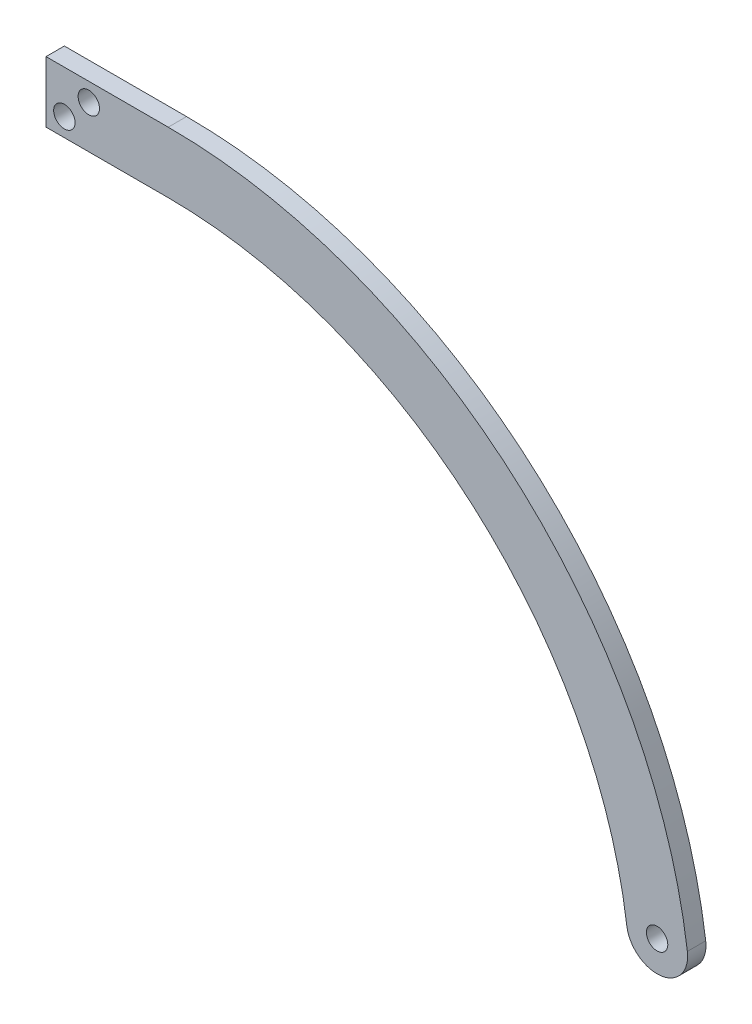
ISO-10303-21;
HEADER;
FILE_DESCRIPTION(('STEP AP214'),'2;1');
FILE_NAME('part.step','',(''),(''),'','','');
FILE_SCHEMA(('AUTOMOTIVE_DESIGN { 1 0 10303 214 1 1 1 1 }'));
ENDSEC;
DATA;
#1=APPLICATION_CONTEXT('core data for automotive mechanical design processes');
#2=APPLICATION_PROTOCOL_DEFINITION('international standard','automotive_design',2000,#1);
#3=PRODUCT_CONTEXT('',#1,'mechanical');
#4=PRODUCT('Part','Part','',(#3));
#5=PRODUCT_RELATED_PRODUCT_CATEGORY('part','',(#4));
#6=PRODUCT_DEFINITION_FORMATION('','',#4);
#7=PRODUCT_DEFINITION_CONTEXT('part definition',#1,'design');
#8=PRODUCT_DEFINITION('design','',#6,#7);
#9=PRODUCT_DEFINITION_SHAPE('','',#8);
#10=(LENGTH_UNIT() NAMED_UNIT(*) SI_UNIT(.MILLI.,.METRE.));
#11=(NAMED_UNIT(*) PLANE_ANGLE_UNIT() SI_UNIT($,.RADIAN.));
#12=(NAMED_UNIT(*) SI_UNIT($,.STERADIAN.) SOLID_ANGLE_UNIT());
#13=UNCERTAINTY_MEASURE_WITH_UNIT(LENGTH_MEASURE(1.E-05),#10,'distance_accuracy_value','');
#14=(GEOMETRIC_REPRESENTATION_CONTEXT(3) GLOBAL_UNCERTAINTY_ASSIGNED_CONTEXT((#13)) GLOBAL_UNIT_ASSIGNED_CONTEXT((#10,
#11,#12)) REPRESENTATION_CONTEXT('',''));
#15=CARTESIAN_POINT('',(0.,0.,0.));
#16=DIRECTION('',(0.,0.,1.));
#17=DIRECTION('',(1.,0.,0.));
#18=AXIS2_PLACEMENT_3D('',#15,#16,#17);
#19=CARTESIAN_POINT('',(0.,-4.99999999999999,3.));
#20=DIRECTION('',(0.,1.,0.));
#21=DIRECTION('',(-1.,0.,0.));
#22=AXIS2_PLACEMENT_3D('',#19,#20,#21);
#23=PLANE('',#22);
#24=DIRECTION('',(1.,0.,0.));
#25=VECTOR('',#24,1.);
#26=CARTESIAN_POINT('',(0.,-4.99999999999999,0.));
#27=LINE('',#26,#25);
#28=CARTESIAN_POINT('',(-20.,-4.99999999999998,0.));
#29=VERTEX_POINT('',#28);
#30=CARTESIAN_POINT('',(0.,-4.99999999999999,0.));
#31=VERTEX_POINT('',#30);
#32=EDGE_CURVE('E126',#29,#31,#27,.T.);
#33=ORIENTED_EDGE('',*,*,#32,.T.);
#34=DIRECTION('',(0.,0.,-1.));
#35=VECTOR('',#34,1.);
#36=CARTESIAN_POINT('',(0.,-4.99999999999999,3.));
#37=LINE('',#36,#35);
#38=CARTESIAN_POINT('',(0.,-4.99999999999999,3.));
#39=VERTEX_POINT('',#38);
#40=EDGE_CURVE('E11',#39,#31,#37,.T.);
#41=ORIENTED_EDGE('',*,*,#40,.F.);
#42=DIRECTION('',(1.,0.,0.));
#43=VECTOR('',#42,1.);
#44=CARTESIAN_POINT('',(0.,-4.99999999999999,3.));
#45=LINE('',#44,#43);
#46=CARTESIAN_POINT('',(-20.,-4.99999999999998,3.));
#47=VERTEX_POINT('',#46);
#48=EDGE_CURVE('E80',#47,#39,#45,.T.);
#49=ORIENTED_EDGE('',*,*,#48,.F.);
#50=DIRECTION('',(0.,0.,-1.));
#51=VECTOR('',#50,1.);
#52=CARTESIAN_POINT('',(-20.,-4.99999999999998,3.));
#53=LINE('',#52,#51);
#54=EDGE_CURVE('E125',#47,#29,#53,.T.);
#55=ORIENTED_EDGE('',*,*,#54,.T.);
#56=EDGE_LOOP('',(#33,#41,#49,#55));
#57=FACE_BOUND('',#56,.T.);
#58=ADVANCED_FACE('F34',(#57),#23,.F.);
#59=CARTESIAN_POINT('',(0.,-80.7142857142857,3.));
#60=DIRECTION('',(0.,0.,-1.));
#61=DIRECTION('',(-1.,0.,0.));
#62=AXIS2_PLACEMENT_3D('',#59,#60,#61);
#63=CYLINDRICAL_SURFACE('',#62,75.7142857142857);
#64=CARTESIAN_POINT('',(0.,-80.7142857142857,0.));
#65=DIRECTION('',(0.,0.,1.));
#66=DIRECTION('',(1.,0.,0.));
#67=AXIS2_PLACEMENT_3D('',#64,#65,#66);
#68=CIRCLE('',#67,75.7142857142857);
#69=CARTESIAN_POINT('',(75.0442477876106,-70.6637168141593,0.));
#70=VERTEX_POINT('',#69);
#71=EDGE_CURVE('E129',#70,#31,#68,.T.);
#72=ORIENTED_EDGE('',*,*,#71,.F.);
#73=DIRECTION('',(0.,0.,-1.));
#74=VECTOR('',#73,1.);
#75=CARTESIAN_POINT('',(75.0442477876106,-70.6637168141593,3.));
#76=LINE('',#75,#74);
#77=CARTESIAN_POINT('',(75.0442477876106,-70.6637168141593,3.));
#78=VERTEX_POINT('',#77);
#79=EDGE_CURVE('E42',#78,#70,#76,.T.);
#80=ORIENTED_EDGE('',*,*,#79,.F.);
#81=CARTESIAN_POINT('',(0.,-80.7142857142857,3.));
#82=DIRECTION('',(0.,0.,1.));
#83=DIRECTION('',(1.,0.,0.));
#84=AXIS2_PLACEMENT_3D('',#81,#82,#83);
#85=CIRCLE('',#84,75.7142857142857);
#86=EDGE_CURVE('E160',#78,#39,#85,.T.);
#87=ORIENTED_EDGE('',*,*,#86,.T.);
#88=ORIENTED_EDGE('',*,*,#40,.T.);
#89=EDGE_LOOP('',(#72,#80,#87,#88));
#90=FACE_BOUND('',#89,.T.);
#91=ADVANCED_FACE('F159',(#90),#63,.F.);
#92=CARTESIAN_POINT('',(80.,-70.,3.));
#93=DIRECTION('',(0.,0.,-1.));
#94=DIRECTION('',(-1.,0.,0.));
#95=AXIS2_PLACEMENT_3D('',#92,#93,#94);
#96=CYLINDRICAL_SURFACE('',#95,5.);
#97=CARTESIAN_POINT('',(80.,-70.,0.));
#98=DIRECTION('',(0.,0.,1.));
#99=DIRECTION('',(1.,0.,0.));
#100=AXIS2_PLACEMENT_3D('',#97,#98,#99);
#101=CIRCLE('',#100,5.);
#102=CARTESIAN_POINT('',(84.9557522123894,-69.3362831858407,0.));
#103=VERTEX_POINT('',#102);
#104=EDGE_CURVE('E132',#70,#103,#101,.T.);
#105=ORIENTED_EDGE('',*,*,#104,.T.);
#106=DIRECTION('',(0.,0.,-1.));
#107=VECTOR('',#106,1.);
#108=CARTESIAN_POINT('',(84.9557522123894,-69.3362831858407,3.));
#109=LINE('',#108,#107);
#110=CARTESIAN_POINT('',(84.9557522123894,-69.3362831858407,3.));
#111=VERTEX_POINT('',#110);
#112=EDGE_CURVE('E109',#111,#103,#109,.T.);
#113=ORIENTED_EDGE('',*,*,#112,.F.);
#114=CARTESIAN_POINT('',(80.,-70.,3.));
#115=DIRECTION('',(0.,0.,1.));
#116=DIRECTION('',(1.,0.,0.));
#117=AXIS2_PLACEMENT_3D('',#114,#115,#116);
#118=CIRCLE('',#117,5.);
#119=EDGE_CURVE('E96',#78,#111,#118,.T.);
#120=ORIENTED_EDGE('',*,*,#119,.F.);
#121=ORIENTED_EDGE('',*,*,#79,.T.);
#122=EDGE_LOOP('',(#105,#113,#120,#121));
#123=FACE_BOUND('',#122,.T.);
#124=ADVANCED_FACE('F151',(#123),#96,.T.);
#125=CARTESIAN_POINT('',(0.,-80.7142857142857,3.));
#126=DIRECTION('',(0.,0.,-1.));
#127=DIRECTION('',(-1.,0.,0.));
#128=AXIS2_PLACEMENT_3D('',#125,#126,#127);
#129=CYLINDRICAL_SURFACE('',#128,85.7142857142857);
#130=CARTESIAN_POINT('',(0.,-80.7142857142857,0.));
#131=DIRECTION('',(0.,0.,1.));
#132=DIRECTION('',(1.,0.,0.));
#133=AXIS2_PLACEMENT_3D('',#130,#131,#132);
#134=CIRCLE('',#133,85.7142857142857);
#135=CARTESIAN_POINT('',(0.,5.00000000000002,0.));
#136=VERTEX_POINT('',#135);
#137=EDGE_CURVE('E105',#103,#136,#134,.T.);
#138=ORIENTED_EDGE('',*,*,#137,.T.);
#139=DIRECTION('',(0.,0.,-1.));
#140=VECTOR('',#139,1.);
#141=CARTESIAN_POINT('',(0.,5.00000000000002,3.));
#142=LINE('',#141,#140);
#143=CARTESIAN_POINT('',(0.,5.00000000000002,3.));
#144=VERTEX_POINT('',#143);
#145=EDGE_CURVE('E102',#144,#136,#142,.T.);
#146=ORIENTED_EDGE('',*,*,#145,.F.);
#147=CARTESIAN_POINT('',(0.,-80.7142857142857,3.));
#148=DIRECTION('',(0.,0.,1.));
#149=DIRECTION('',(1.,0.,0.));
#150=AXIS2_PLACEMENT_3D('',#147,#148,#149);
#151=CIRCLE('',#150,85.7142857142857);
#152=EDGE_CURVE('E89',#111,#144,#151,.T.);
#153=ORIENTED_EDGE('',*,*,#152,.F.);
#154=ORIENTED_EDGE('',*,*,#112,.T.);
#155=EDGE_LOOP('',(#138,#146,#153,#154));
#156=FACE_BOUND('',#155,.T.);
#157=ADVANCED_FACE('F103',(#156),#129,.T.);
#158=CARTESIAN_POINT('',(0.,5.00000000000002,3.));
#159=DIRECTION('',(0.,1.,0.));
#160=DIRECTION('',(0.,0.,1.));
#161=AXIS2_PLACEMENT_3D('',#158,#159,#160);
#162=PLANE('',#161);
#163=DIRECTION('',(1.,0.,0.));
#164=VECTOR('',#163,1.);
#165=CARTESIAN_POINT('',(0.,5.00000000000002,0.));
#166=LINE('',#165,#164);
#167=CARTESIAN_POINT('',(-20.,5.00000000000002,0.));
#168=VERTEX_POINT('',#167);
#169=EDGE_CURVE('E135',#168,#136,#166,.T.);
#170=ORIENTED_EDGE('',*,*,#169,.F.);
#171=DIRECTION('',(0.,0.,-1.));
#172=VECTOR('',#171,1.);
#173=CARTESIAN_POINT('',(-20.,5.00000000000002,3.));
#174=LINE('',#173,#172);
#175=CARTESIAN_POINT('',(-20.,5.00000000000002,3.));
#176=VERTEX_POINT('',#175);
#177=EDGE_CURVE('E71',#176,#168,#174,.T.);
#178=ORIENTED_EDGE('',*,*,#177,.F.);
#179=DIRECTION('',(1.,0.,0.));
#180=VECTOR('',#179,1.);
#181=CARTESIAN_POINT('',(0.,5.00000000000002,3.));
#182=LINE('',#181,#180);
#183=EDGE_CURVE('E94',#176,#144,#182,.T.);
#184=ORIENTED_EDGE('',*,*,#183,.T.);
#185=ORIENTED_EDGE('',*,*,#145,.T.);
#186=EDGE_LOOP('',(#170,#178,#184,#185));
#187=FACE_BOUND('',#186,.T.);
#188=ADVANCED_FACE('F111',(#187),#162,.T.);
#189=CARTESIAN_POINT('',(-13.,1.99999999999999,3.));
#190=DIRECTION('',(0.,0.,-1.));
#191=DIRECTION('',(-1.,0.,0.));
#192=AXIS2_PLACEMENT_3D('',#189,#190,#191);
#193=CYLINDRICAL_SURFACE('',#192,1.74999999999978);
#194=CARTESIAN_POINT('',(-13.,1.99999999999999,3.));
#195=DIRECTION('',(0.,0.,1.));
#196=DIRECTION('',(1.,0.,0.));
#197=AXIS2_PLACEMENT_3D('',#194,#195,#196);
#198=CIRCLE('',#197,1.74999999999978);
#199=CARTESIAN_POINT('',(-11.2500000000002,1.99999999999999,3.));
#200=VERTEX_POINT('',#199);
#201=EDGE_CURVE('E119',#200,#200,#198,.T.);
#202=ORIENTED_EDGE('',*,*,#201,.T.);
#203=EDGE_LOOP('',(#202));
#204=FACE_BOUND('',#203,.T.);
#205=CARTESIAN_POINT('',(-13.,1.99999999999999,0.));
#206=DIRECTION('',(0.,0.,1.));
#207=DIRECTION('',(1.,0.,0.));
#208=AXIS2_PLACEMENT_3D('',#205,#206,#207);
#209=CIRCLE('',#208,1.74999999999978);
#210=CARTESIAN_POINT('',(-11.2500000000002,1.99999999999999,0.));
#211=VERTEX_POINT('',#210);
#212=EDGE_CURVE('E141',#211,#211,#209,.T.);
#213=ORIENTED_EDGE('',*,*,#212,.F.);
#214=EDGE_LOOP('',(#213));
#215=FACE_BOUND('',#214,.T.);
#216=ADVANCED_FACE('F173',(#204,#215),#193,.F.);
#217=CARTESIAN_POINT('',(-17.,-1.99999999999999,3.));
#218=DIRECTION('',(0.,0.,-1.));
#219=DIRECTION('',(-1.,0.,0.));
#220=AXIS2_PLACEMENT_3D('',#217,#218,#219);
#221=CYLINDRICAL_SURFACE('',#220,1.74999999999978);
#222=CARTESIAN_POINT('',(-17.,-1.99999999999999,3.));
#223=DIRECTION('',(0.,0.,1.));
#224=DIRECTION('',(1.,0.,0.));
#225=AXIS2_PLACEMENT_3D('',#222,#223,#224);
#226=CIRCLE('',#225,1.74999999999978);
#227=CARTESIAN_POINT('',(-15.2500000000002,-1.99999999999999,3.));
#228=VERTEX_POINT('',#227);
#229=EDGE_CURVE('E113',#228,#228,#226,.T.);
#230=ORIENTED_EDGE('',*,*,#229,.T.);
#231=EDGE_LOOP('',(#230));
#232=FACE_BOUND('',#231,.T.);
#233=CARTESIAN_POINT('',(-17.,-1.99999999999999,0.));
#234=DIRECTION('',(0.,0.,1.));
#235=DIRECTION('',(1.,0.,0.));
#236=AXIS2_PLACEMENT_3D('',#233,#234,#235);
#237=CIRCLE('',#236,1.74999999999978);
#238=CARTESIAN_POINT('',(-15.2500000000002,-1.99999999999999,0.));
#239=VERTEX_POINT('',#238);
#240=EDGE_CURVE('E138',#239,#239,#237,.T.);
#241=ORIENTED_EDGE('',*,*,#240,.F.);
#242=EDGE_LOOP('',(#241));
#243=FACE_BOUND('',#242,.T.);
#244=ADVANCED_FACE('F165',(#232,#243),#221,.F.);
#245=CARTESIAN_POINT('',(-20.,0.,3.));
#246=DIRECTION('',(1.,0.,0.));
#247=DIRECTION('',(0.,1.,0.));
#248=AXIS2_PLACEMENT_3D('',#245,#246,#247);
#249=PLANE('',#248);
#250=DIRECTION('',(0.,-1.,0.));
#251=VECTOR('',#250,1.);
#252=CARTESIAN_POINT('',(-20.,0.,0.));
#253=LINE('',#252,#251);
#254=EDGE_CURVE('E74',#168,#29,#253,.T.);
#255=ORIENTED_EDGE('',*,*,#254,.T.);
#256=ORIENTED_EDGE('',*,*,#54,.F.);
#257=DIRECTION('',(0.,-1.,0.));
#258=VECTOR('',#257,1.);
#259=CARTESIAN_POINT('',(-20.,0.,3.));
#260=LINE('',#259,#258);
#261=EDGE_CURVE('E50',#176,#47,#260,.T.);
#262=ORIENTED_EDGE('',*,*,#261,.F.);
#263=ORIENTED_EDGE('',*,*,#177,.T.);
#264=EDGE_LOOP('',(#255,#256,#262,#263));
#265=FACE_BOUND('',#264,.T.);
#266=ADVANCED_FACE('F162',(#265),#249,.F.);
#267=CARTESIAN_POINT('',(80.,-70.,3.));
#268=DIRECTION('',(0.,0.,-1.));
#269=DIRECTION('',(-1.,0.,0.));
#270=AXIS2_PLACEMENT_3D('',#267,#268,#269);
#271=CYLINDRICAL_SURFACE('',#270,1.7500000000002);
#272=CARTESIAN_POINT('',(80.,-70.,3.));
#273=DIRECTION('',(0.,0.,1.));
#274=DIRECTION('',(1.,0.,0.));
#275=AXIS2_PLACEMENT_3D('',#272,#273,#274);
#276=CIRCLE('',#275,1.7500000000002);
#277=CARTESIAN_POINT('',(81.7500000000002,-70.,3.));
#278=VERTEX_POINT('',#277);
#279=EDGE_CURVE('E122',#278,#278,#276,.T.);
#280=ORIENTED_EDGE('',*,*,#279,.T.);
#281=EDGE_LOOP('',(#280));
#282=FACE_BOUND('',#281,.T.);
#283=CARTESIAN_POINT('',(80.,-70.,0.));
#284=DIRECTION('',(0.,0.,1.));
#285=DIRECTION('',(1.,0.,0.));
#286=AXIS2_PLACEMENT_3D('',#283,#284,#285);
#287=CIRCLE('',#286,1.7500000000002);
#288=CARTESIAN_POINT('',(81.7500000000002,-70.,0.));
#289=VERTEX_POINT('',#288);
#290=EDGE_CURVE('E144',#289,#289,#287,.T.);
#291=ORIENTED_EDGE('',*,*,#290,.F.);
#292=EDGE_LOOP('',(#291));
#293=FACE_BOUND('',#292,.T.);
#294=ADVANCED_FACE('F164',(#282,#293),#271,.F.);
#295=CARTESIAN_POINT('',(0.,0.,3.));
#296=DIRECTION('',(0.,0.,1.));
#297=DIRECTION('',(1.,0.,0.));
#298=AXIS2_PLACEMENT_3D('',#295,#296,#297);
#299=PLANE('',#298);
#300=ORIENTED_EDGE('',*,*,#48,.T.);
#301=ORIENTED_EDGE('',*,*,#86,.F.);
#302=ORIENTED_EDGE('',*,*,#119,.T.);
#303=ORIENTED_EDGE('',*,*,#152,.T.);
#304=ORIENTED_EDGE('',*,*,#183,.F.);
#305=ORIENTED_EDGE('',*,*,#261,.T.);
#306=EDGE_LOOP('',(#300,#301,#302,#303,#304,#305));
#307=FACE_BOUND('',#306,.T.);
#308=ORIENTED_EDGE('',*,*,#229,.F.);
#309=EDGE_LOOP('',(#308));
#310=FACE_BOUND('',#309,.T.);
#311=ORIENTED_EDGE('',*,*,#201,.F.);
#312=EDGE_LOOP('',(#311));
#313=FACE_BOUND('',#312,.T.);
#314=ORIENTED_EDGE('',*,*,#279,.F.);
#315=EDGE_LOOP('',(#314));
#316=FACE_BOUND('',#315,.T.);
#317=ADVANCED_FACE('F91',(#307,#310,#313,#316),#299,.T.);
#318=CARTESIAN_POINT('',(0.,0.,0.));
#319=DIRECTION('',(0.,0.,1.));
#320=DIRECTION('',(1.,0.,0.));
#321=AXIS2_PLACEMENT_3D('',#318,#319,#320);
#322=PLANE('',#321);
#323=ORIENTED_EDGE('',*,*,#32,.F.);
#324=ORIENTED_EDGE('',*,*,#254,.F.);
#325=ORIENTED_EDGE('',*,*,#169,.T.);
#326=ORIENTED_EDGE('',*,*,#137,.F.);
#327=ORIENTED_EDGE('',*,*,#104,.F.);
#328=ORIENTED_EDGE('',*,*,#71,.T.);
#329=EDGE_LOOP('',(#323,#324,#325,#326,#327,#328));
#330=FACE_BOUND('',#329,.T.);
#331=ORIENTED_EDGE('',*,*,#240,.T.);
#332=EDGE_LOOP('',(#331));
#333=FACE_BOUND('',#332,.T.);
#334=ORIENTED_EDGE('',*,*,#212,.T.);
#335=EDGE_LOOP('',(#334));
#336=FACE_BOUND('',#335,.T.);
#337=ORIENTED_EDGE('',*,*,#290,.T.);
#338=EDGE_LOOP('',(#337));
#339=FACE_BOUND('',#338,.T.);
#340=ADVANCED_FACE('F157',(#330,#333,#336,#339),#322,.F.);
#341=CLOSED_SHELL('',(#58,#91,#124,#157,#188,#216,#244,#266,#294,#317,#340));
#342=MANIFOLD_SOLID_BREP('B2',#341);
#343=ADVANCED_BREP_SHAPE_REPRESENTATION('',(#18,#342),#14);
#344=SHAPE_DEFINITION_REPRESENTATION(#9,#343);
ENDSEC;
END-ISO-10303-21;
